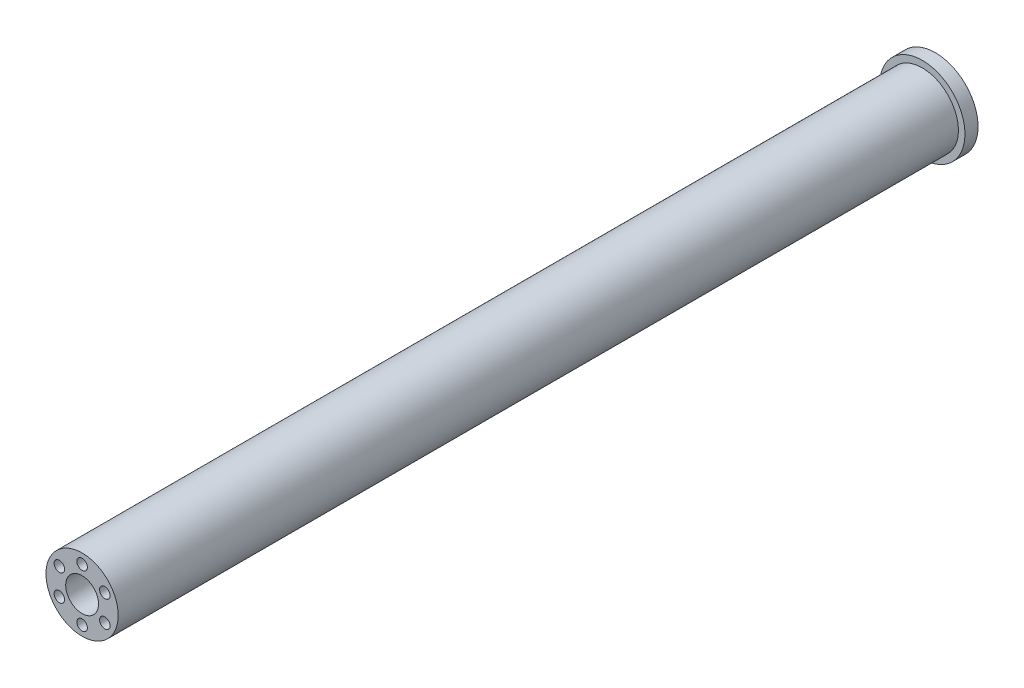
ISO-10303-21;
HEADER;
FILE_DESCRIPTION(('STEP AP214'),'2;1');
FILE_NAME('part.step','',(''),(''),'','','');
FILE_SCHEMA(('AUTOMOTIVE_DESIGN { 1 0 10303 214 1 1 1 1 }'));
ENDSEC;
DATA;
#1=APPLICATION_CONTEXT('core data for automotive mechanical design processes');
#2=APPLICATION_PROTOCOL_DEFINITION('international standard','automotive_design',2000,#1);
#3=PRODUCT_CONTEXT('',#1,'mechanical');
#4=PRODUCT('Part','Part','',(#3));
#5=PRODUCT_RELATED_PRODUCT_CATEGORY('part','',(#4));
#6=PRODUCT_DEFINITION_FORMATION('','',#4);
#7=PRODUCT_DEFINITION_CONTEXT('part definition',#1,'design');
#8=PRODUCT_DEFINITION('design','',#6,#7);
#9=PRODUCT_DEFINITION_SHAPE('','',#8);
#10=(LENGTH_UNIT() NAMED_UNIT(*) SI_UNIT(.MILLI.,.METRE.));
#11=(NAMED_UNIT(*) PLANE_ANGLE_UNIT() SI_UNIT($,.RADIAN.));
#12=(NAMED_UNIT(*) SI_UNIT($,.STERADIAN.) SOLID_ANGLE_UNIT());
#13=UNCERTAINTY_MEASURE_WITH_UNIT(LENGTH_MEASURE(1.E-05),#10,'distance_accuracy_value','');
#14=(GEOMETRIC_REPRESENTATION_CONTEXT(3) GLOBAL_UNCERTAINTY_ASSIGNED_CONTEXT((#13)) GLOBAL_UNIT_ASSIGNED_CONTEXT((#10,
#11,#12)) REPRESENTATION_CONTEXT('',''));
#15=CARTESIAN_POINT('',(0.,0.,0.));
#16=DIRECTION('',(0.,0.,1.));
#17=DIRECTION('',(1.,0.,0.));
#18=AXIS2_PLACEMENT_3D('',#15,#16,#17);
#19=CARTESIAN_POINT('',(0.,0.,0.));
#20=DIRECTION('',(0.,0.,1.));
#21=DIRECTION('',(1.,0.,0.));
#22=AXIS2_PLACEMENT_3D('',#19,#20,#21);
#23=PLANE('',#22);
#24=CARTESIAN_POINT('',(0.,0.,0.));
#25=DIRECTION('',(0.,0.,1.));
#26=DIRECTION('',(1.,0.,0.));
#27=AXIS2_PLACEMENT_3D('',#24,#25,#26);
#28=CIRCLE('',#27,12.5);
#29=CARTESIAN_POINT('',(-12.5,0.,0.));
#30=VERTEX_POINT('',#29);
#31=EDGE_CURVE('E71',#30,#30,#28,.T.);
#32=ORIENTED_EDGE('',*,*,#31,.T.);
#33=EDGE_LOOP('',(#32));
#34=FACE_BOUND('',#33,.T.);
#35=CARTESIAN_POINT('',(0.,0.,0.));
#36=DIRECTION('',(0.,0.,1.));
#37=DIRECTION('',(1.,0.,0.));
#38=AXIS2_PLACEMENT_3D('',#35,#36,#37);
#39=CIRCLE('',#38,32.5);
#40=CARTESIAN_POINT('',(-32.5,0.,0.));
#41=VERTEX_POINT('',#40);
#42=EDGE_CURVE('E11',#41,#41,#39,.T.);
#43=ORIENTED_EDGE('',*,*,#42,.F.);
#44=EDGE_LOOP('',(#43));
#45=FACE_BOUND('',#44,.T.);
#46=ADVANCED_FACE('F17',(#34,#45),#23,.F.);
#47=CARTESIAN_POINT('',(0.,0.,10.));
#48=DIRECTION('',(0.,0.,1.));
#49=DIRECTION('',(1.,0.,0.));
#50=AXIS2_PLACEMENT_3D('',#47,#48,#49);
#51=PLANE('',#50);
#52=CARTESIAN_POINT('',(0.,0.,10.));
#53=DIRECTION('',(0.,0.,-1.));
#54=DIRECTION('',(1.,0.,0.));
#55=AXIS2_PLACEMENT_3D('',#52,#53,#54);
#56=CIRCLE('',#55,27.5);
#57=CARTESIAN_POINT('',(-27.5,0.,10.));
#58=VERTEX_POINT('',#57);
#59=EDGE_CURVE('E131',#58,#58,#56,.T.);
#60=ORIENTED_EDGE('',*,*,#59,.T.);
#61=EDGE_LOOP('',(#60));
#62=FACE_BOUND('',#61,.T.);
#63=CARTESIAN_POINT('',(0.,0.,10.));
#64=DIRECTION('',(0.,0.,1.));
#65=DIRECTION('',(1.,0.,0.));
#66=AXIS2_PLACEMENT_3D('',#63,#64,#65);
#67=CIRCLE('',#66,32.5);
#68=CARTESIAN_POINT('',(-32.5,0.,10.));
#69=VERTEX_POINT('',#68);
#70=EDGE_CURVE('E154',#69,#69,#67,.T.);
#71=ORIENTED_EDGE('',*,*,#70,.T.);
#72=EDGE_LOOP('',(#71));
#73=FACE_BOUND('',#72,.T.);
#74=ADVANCED_FACE('F221',(#62,#73),#51,.T.);
#75=CARTESIAN_POINT('',(0.,0.,0.));
#76=DIRECTION('',(0.,0.,1.));
#77=DIRECTION('',(1.,0.,0.));
#78=AXIS2_PLACEMENT_3D('',#75,#76,#77);
#79=CYLINDRICAL_SURFACE('',#78,32.5);
#80=ORIENTED_EDGE('',*,*,#70,.F.);
#81=DIRECTION('',(0.,0.,-1.));
#82=VECTOR('',#81,1.);
#83=CARTESIAN_POINT('',(-32.5,0.,0.));
#84=LINE('',#83,#82);
#85=EDGE_CURVE('E27',#69,#41,#84,.T.);
#86=ORIENTED_EDGE('',*,*,#85,.T.);
#87=ORIENTED_EDGE('',*,*,#42,.T.);
#88=ORIENTED_EDGE('',*,*,#85,.F.);
#89=EDGE_LOOP('',(#80,#86,#87,#88));
#90=FACE_BOUND('',#89,.T.);
#91=ADVANCED_FACE('F227',(#90),#79,.T.);
#92=CARTESIAN_POINT('',(0.,0.,650.));
#93=DIRECTION('',(0.,0.,1.));
#94=DIRECTION('',(1.,0.,0.));
#95=AXIS2_PLACEMENT_3D('',#92,#93,#94);
#96=PLANE('',#95);
#97=CARTESIAN_POINT('',(0.,20.,650.));
#98=DIRECTION('',(0.,0.,-1.));
#99=DIRECTION('',(1.,0.,0.));
#100=AXIS2_PLACEMENT_3D('',#97,#98,#99);
#101=CIRCLE('',#100,4.);
#102=CARTESIAN_POINT('',(-4.,20.,650.));
#103=VERTEX_POINT('',#102);
#104=EDGE_CURVE('E21',#103,#103,#101,.T.);
#105=ORIENTED_EDGE('',*,*,#104,.T.);
#106=EDGE_LOOP('',(#105));
#107=FACE_BOUND('',#106,.T.);
#108=CARTESIAN_POINT('',(-17.3205080756888,-10.,650.));
#109=DIRECTION('',(0.,0.,-1.));
#110=DIRECTION('',(1.,0.,0.));
#111=AXIS2_PLACEMENT_3D('',#108,#109,#110);
#112=CIRCLE('',#111,4.);
#113=CARTESIAN_POINT('',(-21.3205080756888,-10.,650.));
#114=VERTEX_POINT('',#113);
#115=EDGE_CURVE('E142',#114,#114,#112,.T.);
#116=ORIENTED_EDGE('',*,*,#115,.T.);
#117=EDGE_LOOP('',(#116));
#118=FACE_BOUND('',#117,.T.);
#119=CARTESIAN_POINT('',(0.,-20.,650.));
#120=DIRECTION('',(0.,0.,-1.));
#121=DIRECTION('',(1.,0.,0.));
#122=AXIS2_PLACEMENT_3D('',#119,#120,#121);
#123=CIRCLE('',#122,4.);
#124=CARTESIAN_POINT('',(-4.,-20.,650.));
#125=VERTEX_POINT('',#124);
#126=EDGE_CURVE('E119',#125,#125,#123,.T.);
#127=ORIENTED_EDGE('',*,*,#126,.T.);
#128=EDGE_LOOP('',(#127));
#129=FACE_BOUND('',#128,.T.);
#130=CARTESIAN_POINT('',(17.3205080756888,10.,650.));
#131=DIRECTION('',(0.,0.,-1.));
#132=DIRECTION('',(1.,0.,0.));
#133=AXIS2_PLACEMENT_3D('',#130,#131,#132);
#134=CIRCLE('',#133,4.);
#135=CARTESIAN_POINT('',(13.3205080756888,10.,650.));
#136=VERTEX_POINT('',#135);
#137=EDGE_CURVE('E127',#136,#136,#134,.T.);
#138=ORIENTED_EDGE('',*,*,#137,.T.);
#139=EDGE_LOOP('',(#138));
#140=FACE_BOUND('',#139,.T.);
#141=CARTESIAN_POINT('',(-17.3205080756888,10.,650.));
#142=DIRECTION('',(0.,0.,-1.));
#143=DIRECTION('',(1.,0.,0.));
#144=AXIS2_PLACEMENT_3D('',#141,#142,#143);
#145=CIRCLE('',#144,4.);
#146=CARTESIAN_POINT('',(-21.3205080756888,10.,650.));
#147=VERTEX_POINT('',#146);
#148=EDGE_CURVE('E133',#147,#147,#145,.T.);
#149=ORIENTED_EDGE('',*,*,#148,.T.);
#150=EDGE_LOOP('',(#149));
#151=FACE_BOUND('',#150,.T.);
#152=CARTESIAN_POINT('',(17.3205080756888,-10.,650.));
#153=DIRECTION('',(0.,0.,-1.));
#154=DIRECTION('',(1.,0.,0.));
#155=AXIS2_PLACEMENT_3D('',#152,#153,#154);
#156=CIRCLE('',#155,4.);
#157=CARTESIAN_POINT('',(13.3205080756888,-10.,650.));
#158=VERTEX_POINT('',#157);
#159=EDGE_CURVE('E157',#158,#158,#156,.T.);
#160=ORIENTED_EDGE('',*,*,#159,.T.);
#161=EDGE_LOOP('',(#160));
#162=FACE_BOUND('',#161,.T.);
#163=CARTESIAN_POINT('',(0.,0.,650.));
#164=DIRECTION('',(0.,0.,-1.));
#165=DIRECTION('',(1.,0.,0.));
#166=AXIS2_PLACEMENT_3D('',#163,#164,#165);
#167=CIRCLE('',#166,12.5);
#168=CARTESIAN_POINT('',(-12.5,0.,650.));
#169=VERTEX_POINT('',#168);
#170=EDGE_CURVE('E145',#169,#169,#167,.T.);
#171=ORIENTED_EDGE('',*,*,#170,.T.);
#172=EDGE_LOOP('',(#171));
#173=FACE_BOUND('',#172,.T.);
#174=CARTESIAN_POINT('',(0.,0.,650.));
#175=DIRECTION('',(0.,0.,1.));
#176=DIRECTION('',(1.,0.,0.));
#177=AXIS2_PLACEMENT_3D('',#174,#175,#176);
#178=CIRCLE('',#177,27.5);
#179=CARTESIAN_POINT('',(-27.5,0.,650.));
#180=VERTEX_POINT('',#179);
#181=EDGE_CURVE('E183',#180,#180,#178,.T.);
#182=ORIENTED_EDGE('',*,*,#181,.T.);
#183=EDGE_LOOP('',(#182));
#184=FACE_BOUND('',#183,.T.);
#185=ADVANCED_FACE('F225',(#107,#118,#129,#140,#151,#162,#173,#184),#96,.T.);
#186=CARTESIAN_POINT('',(0.,0.,0.));
#187=DIRECTION('',(0.,0.,1.));
#188=DIRECTION('',(1.,0.,0.));
#189=AXIS2_PLACEMENT_3D('',#186,#187,#188);
#190=CYLINDRICAL_SURFACE('',#189,27.5);
#191=ORIENTED_EDGE('',*,*,#181,.F.);
#192=DIRECTION('',(0.,0.,-1.));
#193=VECTOR('',#192,1.);
#194=CARTESIAN_POINT('',(-27.5,0.,0.));
#195=LINE('',#194,#193);
#196=EDGE_CURVE('E201',#180,#58,#195,.T.);
#197=ORIENTED_EDGE('',*,*,#196,.T.);
#198=ORIENTED_EDGE('',*,*,#59,.F.);
#199=ORIENTED_EDGE('',*,*,#196,.F.);
#200=EDGE_LOOP('',(#191,#197,#198,#199));
#201=FACE_BOUND('',#200,.T.);
#202=ADVANCED_FACE('F223',(#201),#190,.T.);
#203=CARTESIAN_POINT('',(0.,20.,615.));
#204=DIRECTION('',(0.,0.,1.));
#205=DIRECTION('',(1.,0.,0.));
#206=AXIS2_PLACEMENT_3D('',#203,#204,#205);
#207=PLANE('',#206);
#208=CARTESIAN_POINT('',(0.,20.,615.));
#209=DIRECTION('',(0.,0.,-1.));
#210=DIRECTION('',(1.,0.,0.));
#211=AXIS2_PLACEMENT_3D('',#208,#209,#210);
#212=CIRCLE('',#211,4.);
#213=CARTESIAN_POINT('',(-4.,20.,615.));
#214=VERTEX_POINT('',#213);
#215=EDGE_CURVE('E188',#214,#214,#212,.T.);
#216=ORIENTED_EDGE('',*,*,#215,.F.);
#217=EDGE_LOOP('',(#216));
#218=FACE_BOUND('',#217,.T.);
#219=ADVANCED_FACE('F236',(#218),#207,.T.);
#220=CARTESIAN_POINT('',(0.,20.,650.));
#221=DIRECTION('',(0.,0.,-1.));
#222=DIRECTION('',(1.,0.,0.));
#223=AXIS2_PLACEMENT_3D('',#220,#221,#222);
#224=CYLINDRICAL_SURFACE('',#223,4.);
#225=ORIENTED_EDGE('',*,*,#104,.F.);
#226=DIRECTION('',(0.,0.,-1.));
#227=VECTOR('',#226,1.);
#228=CARTESIAN_POINT('',(-4.,20.,650.));
#229=LINE('',#228,#227);
#230=EDGE_CURVE('E191',#103,#214,#229,.T.);
#231=ORIENTED_EDGE('',*,*,#230,.T.);
#232=ORIENTED_EDGE('',*,*,#215,.T.);
#233=ORIENTED_EDGE('',*,*,#230,.F.);
#234=EDGE_LOOP('',(#225,#231,#232,#233));
#235=FACE_BOUND('',#234,.T.);
#236=ADVANCED_FACE('F289',(#235),#224,.F.);
#237=CARTESIAN_POINT('',(-17.3205080756888,-10.,615.));
#238=DIRECTION('',(0.,0.,1.));
#239=DIRECTION('',(1.,0.,0.));
#240=AXIS2_PLACEMENT_3D('',#237,#238,#239);
#241=PLANE('',#240);
#242=CARTESIAN_POINT('',(-17.3205080756888,-10.,615.));
#243=DIRECTION('',(0.,0.,-1.));
#244=DIRECTION('',(1.,0.,0.));
#245=AXIS2_PLACEMENT_3D('',#242,#243,#244);
#246=CIRCLE('',#245,4.);
#247=CARTESIAN_POINT('',(-21.3205080756888,-10.,615.));
#248=VERTEX_POINT('',#247);
#249=EDGE_CURVE('E162',#248,#248,#246,.T.);
#250=ORIENTED_EDGE('',*,*,#249,.F.);
#251=EDGE_LOOP('',(#250));
#252=FACE_BOUND('',#251,.T.);
#253=ADVANCED_FACE('F254',(#252),#241,.T.);
#254=CARTESIAN_POINT('',(-17.3205080756888,-10.,650.));
#255=DIRECTION('',(0.,0.,-1.));
#256=DIRECTION('',(1.,0.,0.));
#257=AXIS2_PLACEMENT_3D('',#254,#255,#256);
#258=CYLINDRICAL_SURFACE('',#257,4.);
#259=ORIENTED_EDGE('',*,*,#115,.F.);
#260=DIRECTION('',(0.,0.,-1.));
#261=VECTOR('',#260,1.);
#262=CARTESIAN_POINT('',(-21.3205080756888,-10.,650.));
#263=LINE('',#262,#261);
#264=EDGE_CURVE('E166',#114,#248,#263,.T.);
#265=ORIENTED_EDGE('',*,*,#264,.T.);
#266=ORIENTED_EDGE('',*,*,#249,.T.);
#267=ORIENTED_EDGE('',*,*,#264,.F.);
#268=EDGE_LOOP('',(#259,#265,#266,#267));
#269=FACE_BOUND('',#268,.T.);
#270=ADVANCED_FACE('F251',(#269),#258,.F.);
#271=CARTESIAN_POINT('',(0.,-20.,615.));
#272=DIRECTION('',(0.,0.,1.));
#273=DIRECTION('',(1.,0.,0.));
#274=AXIS2_PLACEMENT_3D('',#271,#272,#273);
#275=PLANE('',#274);
#276=CARTESIAN_POINT('',(0.,-20.,615.));
#277=DIRECTION('',(0.,0.,-1.));
#278=DIRECTION('',(1.,0.,0.));
#279=AXIS2_PLACEMENT_3D('',#276,#277,#278);
#280=CIRCLE('',#279,4.);
#281=CARTESIAN_POINT('',(-4.,-20.,615.));
#282=VERTEX_POINT('',#281);
#283=EDGE_CURVE('E139',#282,#282,#280,.T.);
#284=ORIENTED_EDGE('',*,*,#283,.F.);
#285=EDGE_LOOP('',(#284));
#286=FACE_BOUND('',#285,.T.);
#287=ADVANCED_FACE('F253',(#286),#275,.T.);
#288=CARTESIAN_POINT('',(0.,-20.,650.));
#289=DIRECTION('',(0.,0.,-1.));
#290=DIRECTION('',(1.,0.,0.));
#291=AXIS2_PLACEMENT_3D('',#288,#289,#290);
#292=CYLINDRICAL_SURFACE('',#291,4.);
#293=ORIENTED_EDGE('',*,*,#126,.F.);
#294=DIRECTION('',(0.,0.,-1.));
#295=VECTOR('',#294,1.);
#296=CARTESIAN_POINT('',(-4.,-20.,650.));
#297=LINE('',#296,#295);
#298=EDGE_CURVE('E102',#125,#282,#297,.T.);
#299=ORIENTED_EDGE('',*,*,#298,.T.);
#300=ORIENTED_EDGE('',*,*,#283,.T.);
#301=ORIENTED_EDGE('',*,*,#298,.F.);
#302=EDGE_LOOP('',(#293,#299,#300,#301));
#303=FACE_BOUND('',#302,.T.);
#304=ADVANCED_FACE('F281',(#303),#292,.F.);
#305=CARTESIAN_POINT('',(17.3205080756888,10.,615.));
#306=DIRECTION('',(0.,0.,1.));
#307=DIRECTION('',(1.,0.,0.));
#308=AXIS2_PLACEMENT_3D('',#305,#306,#307);
#309=PLANE('',#308);
#310=CARTESIAN_POINT('',(17.3205080756888,10.,615.));
#311=DIRECTION('',(0.,0.,-1.));
#312=DIRECTION('',(1.,0.,0.));
#313=AXIS2_PLACEMENT_3D('',#310,#311,#312);
#314=CIRCLE('',#313,4.);
#315=CARTESIAN_POINT('',(13.3205080756888,10.,615.));
#316=VERTEX_POINT('',#315);
#317=EDGE_CURVE('E112',#316,#316,#314,.T.);
#318=ORIENTED_EDGE('',*,*,#317,.F.);
#319=EDGE_LOOP('',(#318));
#320=FACE_BOUND('',#319,.T.);
#321=ADVANCED_FACE('F19',(#320),#309,.T.);
#322=CARTESIAN_POINT('',(17.3205080756888,10.,650.));
#323=DIRECTION('',(0.,0.,-1.));
#324=DIRECTION('',(1.,0.,0.));
#325=AXIS2_PLACEMENT_3D('',#322,#323,#324);
#326=CYLINDRICAL_SURFACE('',#325,4.);
#327=ORIENTED_EDGE('',*,*,#137,.F.);
#328=DIRECTION('',(0.,0.,-1.));
#329=VECTOR('',#328,1.);
#330=CARTESIAN_POINT('',(13.3205080756888,10.,650.));
#331=LINE('',#330,#329);
#332=EDGE_CURVE('E115',#136,#316,#331,.T.);
#333=ORIENTED_EDGE('',*,*,#332,.T.);
#334=ORIENTED_EDGE('',*,*,#317,.T.);
#335=ORIENTED_EDGE('',*,*,#332,.F.);
#336=EDGE_LOOP('',(#327,#333,#334,#335));
#337=FACE_BOUND('',#336,.T.);
#338=ADVANCED_FACE('F114',(#337),#326,.F.);
#339=CARTESIAN_POINT('',(-17.3205080756888,10.,615.));
#340=DIRECTION('',(0.,0.,1.));
#341=DIRECTION('',(1.,0.,0.));
#342=AXIS2_PLACEMENT_3D('',#339,#340,#341);
#343=PLANE('',#342);
#344=CARTESIAN_POINT('',(-17.3205080756888,10.,615.));
#345=DIRECTION('',(0.,0.,-1.));
#346=DIRECTION('',(1.,0.,0.));
#347=AXIS2_PLACEMENT_3D('',#344,#345,#346);
#348=CIRCLE('',#347,4.);
#349=CARTESIAN_POINT('',(-21.3205080756888,10.,615.));
#350=VERTEX_POINT('',#349);
#351=EDGE_CURVE('E150',#350,#350,#348,.T.);
#352=ORIENTED_EDGE('',*,*,#351,.F.);
#353=EDGE_LOOP('',(#352));
#354=FACE_BOUND('',#353,.T.);
#355=ADVANCED_FACE('F277',(#354),#343,.T.);
#356=CARTESIAN_POINT('',(-17.3205080756888,10.,650.));
#357=DIRECTION('',(0.,0.,-1.));
#358=DIRECTION('',(1.,0.,0.));
#359=AXIS2_PLACEMENT_3D('',#356,#357,#358);
#360=CYLINDRICAL_SURFACE('',#359,4.);
#361=ORIENTED_EDGE('',*,*,#148,.F.);
#362=DIRECTION('',(0.,0.,-1.));
#363=VECTOR('',#362,1.);
#364=CARTESIAN_POINT('',(-21.3205080756888,10.,650.));
#365=LINE('',#364,#363);
#366=EDGE_CURVE('E137',#147,#350,#365,.T.);
#367=ORIENTED_EDGE('',*,*,#366,.T.);
#368=ORIENTED_EDGE('',*,*,#351,.T.);
#369=ORIENTED_EDGE('',*,*,#366,.F.);
#370=EDGE_LOOP('',(#361,#367,#368,#369));
#371=FACE_BOUND('',#370,.T.);
#372=ADVANCED_FACE('F270',(#371),#360,.F.);
#373=CARTESIAN_POINT('',(17.3205080756888,-10.,615.));
#374=DIRECTION('',(0.,0.,1.));
#375=DIRECTION('',(1.,0.,0.));
#376=AXIS2_PLACEMENT_3D('',#373,#374,#375);
#377=PLANE('',#376);
#378=CARTESIAN_POINT('',(17.3205080756888,-10.,615.));
#379=DIRECTION('',(0.,0.,-1.));
#380=DIRECTION('',(1.,0.,0.));
#381=AXIS2_PLACEMENT_3D('',#378,#379,#380);
#382=CIRCLE('',#381,4.);
#383=CARTESIAN_POINT('',(13.3205080756888,-10.,615.));
#384=VERTEX_POINT('',#383);
#385=EDGE_CURVE('E138',#384,#384,#382,.T.);
#386=ORIENTED_EDGE('',*,*,#385,.F.);
#387=EDGE_LOOP('',(#386));
#388=FACE_BOUND('',#387,.T.);
#389=ADVANCED_FACE('F263',(#388),#377,.T.);
#390=CARTESIAN_POINT('',(17.3205080756888,-10.,650.));
#391=DIRECTION('',(0.,0.,-1.));
#392=DIRECTION('',(1.,0.,0.));
#393=AXIS2_PLACEMENT_3D('',#390,#391,#392);
#394=CYLINDRICAL_SURFACE('',#393,4.);
#395=ORIENTED_EDGE('',*,*,#159,.F.);
#396=DIRECTION('',(0.,0.,-1.));
#397=VECTOR('',#396,1.);
#398=CARTESIAN_POINT('',(13.3205080756888,-10.,650.));
#399=LINE('',#398,#397);
#400=EDGE_CURVE('E161',#158,#384,#399,.T.);
#401=ORIENTED_EDGE('',*,*,#400,.T.);
#402=ORIENTED_EDGE('',*,*,#385,.T.);
#403=ORIENTED_EDGE('',*,*,#400,.F.);
#404=EDGE_LOOP('',(#395,#401,#402,#403));
#405=FACE_BOUND('',#404,.T.);
#406=ADVANCED_FACE('F258',(#405),#394,.F.);
#407=CARTESIAN_POINT('',(0.,0.,650.));
#408=DIRECTION('',(0.,0.,-1.));
#409=DIRECTION('',(1.,0.,0.));
#410=AXIS2_PLACEMENT_3D('',#407,#408,#409);
#411=CYLINDRICAL_SURFACE('',#410,12.5);
#412=ORIENTED_EDGE('',*,*,#170,.F.);
#413=DIRECTION('',(0.,0.,-1.));
#414=VECTOR('',#413,1.);
#415=CARTESIAN_POINT('',(-12.5,0.,650.));
#416=LINE('',#415,#414);
#417=EDGE_CURVE('E61',#169,#30,#416,.T.);
#418=ORIENTED_EDGE('',*,*,#417,.T.);
#419=ORIENTED_EDGE('',*,*,#31,.F.);
#420=ORIENTED_EDGE('',*,*,#417,.F.);
#421=EDGE_LOOP('',(#412,#418,#419,#420));
#422=FACE_BOUND('',#421,.T.);
#423=ADVANCED_FACE('F256',(#422),#411,.F.);
#424=CLOSED_SHELL('',(#46,#74,#91,#185,#202,#219,#236,#253,#270,#287,#304,#321,#338,#355,#372,
#389,#406,#423));
#425=MANIFOLD_SOLID_BREP('B1',#424);
#426=ADVANCED_BREP_SHAPE_REPRESENTATION('',(#18,#425),#14);
#427=SHAPE_DEFINITION_REPRESENTATION(#9,#426);
ENDSEC;
END-ISO-10303-21;
